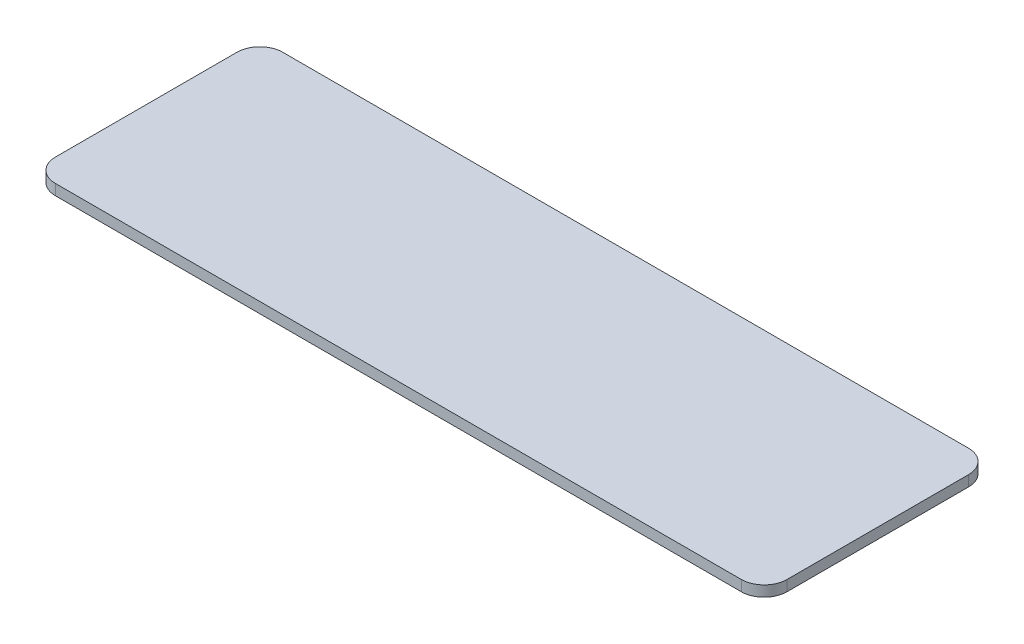
ISO-10303-21;
HEADER;
FILE_DESCRIPTION(('STEP AP214'),'2;1');
FILE_NAME('part.step','',(''),(''),'','','');
FILE_SCHEMA(('AUTOMOTIVE_DESIGN { 1 0 10303 214 1 1 1 1 }'));
ENDSEC;
DATA;
#1=APPLICATION_CONTEXT('core data for automotive mechanical design processes');
#2=APPLICATION_PROTOCOL_DEFINITION('international standard','automotive_design',2000,#1);
#3=PRODUCT_CONTEXT('',#1,'mechanical');
#4=PRODUCT('Part','Part','',(#3));
#5=PRODUCT_RELATED_PRODUCT_CATEGORY('part','',(#4));
#6=PRODUCT_DEFINITION_FORMATION('','',#4);
#7=PRODUCT_DEFINITION_CONTEXT('part definition',#1,'design');
#8=PRODUCT_DEFINITION('design','',#6,#7);
#9=PRODUCT_DEFINITION_SHAPE('','',#8);
#10=(LENGTH_UNIT() NAMED_UNIT(*) SI_UNIT(.MILLI.,.METRE.));
#11=(NAMED_UNIT(*) PLANE_ANGLE_UNIT() SI_UNIT($,.RADIAN.));
#12=(NAMED_UNIT(*) SI_UNIT($,.STERADIAN.) SOLID_ANGLE_UNIT());
#13=UNCERTAINTY_MEASURE_WITH_UNIT(LENGTH_MEASURE(1.E-05),#10,'distance_accuracy_value','');
#14=(GEOMETRIC_REPRESENTATION_CONTEXT(3) GLOBAL_UNCERTAINTY_ASSIGNED_CONTEXT((#13)) GLOBAL_UNIT_ASSIGNED_CONTEXT((#10,
#11,#12)) REPRESENTATION_CONTEXT('',''));
#15=CARTESIAN_POINT('',(0.,0.,0.));
#16=DIRECTION('',(0.,0.,1.));
#17=DIRECTION('',(1.,0.,0.));
#18=AXIS2_PLACEMENT_3D('',#15,#16,#17);
#19=CARTESIAN_POINT('',(51.,1.5875,-13.5));
#20=DIRECTION('',(0.,-1.,0.));
#21=DIRECTION('',(0.,0.,-1.));
#22=AXIS2_PLACEMENT_3D('',#19,#20,#21);
#23=CYLINDRICAL_SURFACE('',#22,3.4);
#24=CARTESIAN_POINT('',(51.,0.,-13.5));
#25=DIRECTION('',(0.,1.,0.));
#26=DIRECTION('',(0.,0.,1.));
#27=AXIS2_PLACEMENT_3D('',#24,#25,#26);
#28=CIRCLE('',#27,3.4);
#29=CARTESIAN_POINT('',(54.4,0.,-13.5));
#30=VERTEX_POINT('',#29);
#31=CARTESIAN_POINT('',(51.,0.,-16.9));
#32=VERTEX_POINT('',#31);
#33=EDGE_CURVE('E135',#30,#32,#28,.T.);
#34=ORIENTED_EDGE('',*,*,#33,.T.);
#35=DIRECTION('',(0.,-1.,0.));
#36=VECTOR('',#35,1.);
#37=CARTESIAN_POINT('',(51.,1.5875,-16.9));
#38=LINE('',#37,#36);
#39=CARTESIAN_POINT('',(51.,1.5875,-16.9));
#40=VERTEX_POINT('',#39);
#41=EDGE_CURVE('E11',#40,#32,#38,.T.);
#42=ORIENTED_EDGE('',*,*,#41,.F.);
#43=CARTESIAN_POINT('',(51.,1.5875,-13.5));
#44=DIRECTION('',(0.,1.,0.));
#45=DIRECTION('',(0.,0.,1.));
#46=AXIS2_PLACEMENT_3D('',#43,#44,#45);
#47=CIRCLE('',#46,3.4);
#48=CARTESIAN_POINT('',(54.4,1.5875,-13.5));
#49=VERTEX_POINT('',#48);
#50=EDGE_CURVE('E151',#49,#40,#47,.T.);
#51=ORIENTED_EDGE('',*,*,#50,.F.);
#52=DIRECTION('',(0.,-1.,0.));
#53=VECTOR('',#52,1.);
#54=CARTESIAN_POINT('',(54.4,1.5875,-13.5));
#55=LINE('',#54,#53);
#56=EDGE_CURVE('E131',#49,#30,#55,.T.);
#57=ORIENTED_EDGE('',*,*,#56,.T.);
#58=EDGE_LOOP('',(#34,#42,#51,#57));
#59=FACE_BOUND('',#58,.T.);
#60=ADVANCED_FACE('F38',(#59),#23,.T.);
#61=CARTESIAN_POINT('',(51.,1.5875,-16.9));
#62=DIRECTION('',(0.,0.,1.));
#63=DIRECTION('',(1.,0.,0.));
#64=AXIS2_PLACEMENT_3D('',#61,#62,#63);
#65=PLANE('',#64);
#66=DIRECTION('',(-1.,0.,0.));
#67=VECTOR('',#66,1.);
#68=CARTESIAN_POINT('',(51.,0.,-16.9));
#69=LINE('',#68,#67);
#70=CARTESIAN_POINT('',(-51.,0.,-16.9));
#71=VERTEX_POINT('',#70);
#72=EDGE_CURVE('E138',#32,#71,#69,.T.);
#73=ORIENTED_EDGE('',*,*,#72,.T.);
#74=DIRECTION('',(0.,-1.,0.));
#75=VECTOR('',#74,1.);
#76=CARTESIAN_POINT('',(-51.,1.5875,-16.9));
#77=LINE('',#76,#75);
#78=CARTESIAN_POINT('',(-51.,1.5875,-16.9));
#79=VERTEX_POINT('',#78);
#80=EDGE_CURVE('E46',#79,#71,#77,.T.);
#81=ORIENTED_EDGE('',*,*,#80,.F.);
#82=DIRECTION('',(-1.,0.,0.));
#83=VECTOR('',#82,1.);
#84=CARTESIAN_POINT('',(51.,1.5875,-16.9));
#85=LINE('',#84,#83);
#86=EDGE_CURVE('E97',#40,#79,#85,.T.);
#87=ORIENTED_EDGE('',*,*,#86,.F.);
#88=ORIENTED_EDGE('',*,*,#41,.T.);
#89=EDGE_LOOP('',(#73,#81,#87,#88));
#90=FACE_BOUND('',#89,.T.);
#91=ADVANCED_FACE('F186',(#90),#65,.F.);
#92=CARTESIAN_POINT('',(-51.,1.5875,-13.5));
#93=DIRECTION('',(0.,-1.,0.));
#94=DIRECTION('',(0.,0.,-1.));
#95=AXIS2_PLACEMENT_3D('',#92,#93,#94);
#96=CYLINDRICAL_SURFACE('',#95,3.40000000000001);
#97=CARTESIAN_POINT('',(-51.,0.,-13.5));
#98=DIRECTION('',(0.,1.,0.));
#99=DIRECTION('',(0.,0.,1.));
#100=AXIS2_PLACEMENT_3D('',#97,#98,#99);
#101=CIRCLE('',#100,3.40000000000001);
#102=CARTESIAN_POINT('',(-54.4,0.,-13.5));
#103=VERTEX_POINT('',#102);
#104=EDGE_CURVE('E141',#71,#103,#101,.T.);
#105=ORIENTED_EDGE('',*,*,#104,.T.);
#106=DIRECTION('',(0.,-1.,0.));
#107=VECTOR('',#106,1.);
#108=CARTESIAN_POINT('',(-54.4,1.5875,-13.5));
#109=LINE('',#108,#107);
#110=CARTESIAN_POINT('',(-54.4,1.5875,-13.5));
#111=VERTEX_POINT('',#110);
#112=EDGE_CURVE('E158',#111,#103,#109,.T.);
#113=ORIENTED_EDGE('',*,*,#112,.F.);
#114=CARTESIAN_POINT('',(-51.,1.5875,-13.5));
#115=DIRECTION('',(0.,1.,0.));
#116=DIRECTION('',(0.,0.,1.));
#117=AXIS2_PLACEMENT_3D('',#114,#115,#116);
#118=CIRCLE('',#117,3.40000000000001);
#119=EDGE_CURVE('E166',#79,#111,#118,.T.);
#120=ORIENTED_EDGE('',*,*,#119,.F.);
#121=ORIENTED_EDGE('',*,*,#80,.T.);
#122=EDGE_LOOP('',(#105,#113,#120,#121));
#123=FACE_BOUND('',#122,.T.);
#124=ADVANCED_FACE('F164',(#123),#96,.T.);
#125=CARTESIAN_POINT('',(-54.4,1.5875,13.5));
#126=DIRECTION('',(1.,0.,0.));
#127=DIRECTION('',(0.,0.,-1.));
#128=AXIS2_PLACEMENT_3D('',#125,#126,#127);
#129=PLANE('',#128);
#130=DIRECTION('',(0.,0.,1.));
#131=VECTOR('',#130,1.);
#132=CARTESIAN_POINT('',(-54.4,0.,13.5));
#133=LINE('',#132,#131);
#134=CARTESIAN_POINT('',(-54.4,0.,13.5));
#135=VERTEX_POINT('',#134);
#136=EDGE_CURVE('E143',#103,#135,#133,.T.);
#137=ORIENTED_EDGE('',*,*,#136,.T.);
#138=DIRECTION('',(0.,-1.,0.));
#139=VECTOR('',#138,1.);
#140=CARTESIAN_POINT('',(-54.4,1.5875,13.5));
#141=LINE('',#140,#139);
#142=CARTESIAN_POINT('',(-54.4,1.5875,13.5));
#143=VERTEX_POINT('',#142);
#144=EDGE_CURVE('E155',#143,#135,#141,.T.);
#145=ORIENTED_EDGE('',*,*,#144,.F.);
#146=DIRECTION('',(0.,0.,1.));
#147=VECTOR('',#146,1.);
#148=CARTESIAN_POINT('',(-54.4,1.5875,13.5));
#149=LINE('',#148,#147);
#150=EDGE_CURVE('E178',#111,#143,#149,.T.);
#151=ORIENTED_EDGE('',*,*,#150,.F.);
#152=ORIENTED_EDGE('',*,*,#112,.T.);
#153=EDGE_LOOP('',(#137,#145,#151,#152));
#154=FACE_BOUND('',#153,.T.);
#155=ADVANCED_FACE('F174',(#154),#129,.F.);
#156=CARTESIAN_POINT('',(-51.,1.5875,13.5));
#157=DIRECTION('',(0.,-1.,0.));
#158=DIRECTION('',(0.,0.,-1.));
#159=AXIS2_PLACEMENT_3D('',#156,#157,#158);
#160=CYLINDRICAL_SURFACE('',#159,3.4);
#161=CARTESIAN_POINT('',(-51.,0.,13.5));
#162=DIRECTION('',(0.,1.,0.));
#163=DIRECTION('',(0.,0.,-1.));
#164=AXIS2_PLACEMENT_3D('',#161,#162,#163);
#165=CIRCLE('',#164,3.4);
#166=CARTESIAN_POINT('',(-51.,0.,16.9));
#167=VERTEX_POINT('',#166);
#168=EDGE_CURVE('E145',#135,#167,#165,.T.);
#169=ORIENTED_EDGE('',*,*,#168,.T.);
#170=DIRECTION('',(0.,-1.,0.));
#171=VECTOR('',#170,1.);
#172=CARTESIAN_POINT('',(-51.,1.5875,16.9));
#173=LINE('',#172,#171);
#174=CARTESIAN_POINT('',(-51.,1.5875,16.9));
#175=VERTEX_POINT('',#174);
#176=EDGE_CURVE('E126',#175,#167,#173,.T.);
#177=ORIENTED_EDGE('',*,*,#176,.F.);
#178=CARTESIAN_POINT('',(-51.,1.5875,13.5));
#179=DIRECTION('',(0.,1.,0.));
#180=DIRECTION('',(0.,0.,-1.));
#181=AXIS2_PLACEMENT_3D('',#178,#179,#180);
#182=CIRCLE('',#181,3.4);
#183=EDGE_CURVE('E116',#143,#175,#182,.T.);
#184=ORIENTED_EDGE('',*,*,#183,.F.);
#185=ORIENTED_EDGE('',*,*,#144,.T.);
#186=EDGE_LOOP('',(#169,#177,#184,#185));
#187=FACE_BOUND('',#186,.T.);
#188=ADVANCED_FACE('F177',(#187),#160,.T.);
#189=CARTESIAN_POINT('',(51.,1.5875,16.9));
#190=DIRECTION('',(0.,0.,-1.));
#191=DIRECTION('',(-1.,0.,0.));
#192=AXIS2_PLACEMENT_3D('',#189,#190,#191);
#193=PLANE('',#192);
#194=DIRECTION('',(1.,0.,0.));
#195=VECTOR('',#194,1.);
#196=CARTESIAN_POINT('',(51.,0.,16.9));
#197=LINE('',#196,#195);
#198=CARTESIAN_POINT('',(51.,0.,16.9));
#199=VERTEX_POINT('',#198);
#200=EDGE_CURVE('E125',#167,#199,#197,.T.);
#201=ORIENTED_EDGE('',*,*,#200,.T.);
#202=DIRECTION('',(0.,-1.,0.));
#203=VECTOR('',#202,1.);
#204=CARTESIAN_POINT('',(51.,1.5875,16.9));
#205=LINE('',#204,#203);
#206=CARTESIAN_POINT('',(51.,1.5875,16.9));
#207=VERTEX_POINT('',#206);
#208=EDGE_CURVE('E122',#207,#199,#205,.T.);
#209=ORIENTED_EDGE('',*,*,#208,.F.);
#210=DIRECTION('',(1.,0.,0.));
#211=VECTOR('',#210,1.);
#212=CARTESIAN_POINT('',(51.,1.5875,16.9));
#213=LINE('',#212,#211);
#214=EDGE_CURVE('E110',#175,#207,#213,.T.);
#215=ORIENTED_EDGE('',*,*,#214,.F.);
#216=ORIENTED_EDGE('',*,*,#176,.T.);
#217=EDGE_LOOP('',(#201,#209,#215,#216));
#218=FACE_BOUND('',#217,.T.);
#219=ADVANCED_FACE('F123',(#218),#193,.F.);
#220=CARTESIAN_POINT('',(51.,1.5875,13.5));
#221=DIRECTION('',(0.,-1.,0.));
#222=DIRECTION('',(0.,0.,-1.));
#223=AXIS2_PLACEMENT_3D('',#220,#221,#222);
#224=CYLINDRICAL_SURFACE('',#223,3.4);
#225=CARTESIAN_POINT('',(51.,0.,13.5));
#226=DIRECTION('',(0.,1.,0.));
#227=DIRECTION('',(0.,0.,1.));
#228=AXIS2_PLACEMENT_3D('',#225,#226,#227);
#229=CIRCLE('',#228,3.4);
#230=CARTESIAN_POINT('',(54.4,0.,13.5));
#231=VERTEX_POINT('',#230);
#232=EDGE_CURVE('E83',#199,#231,#229,.T.);
#233=ORIENTED_EDGE('',*,*,#232,.T.);
#234=DIRECTION('',(0.,-1.,0.));
#235=VECTOR('',#234,1.);
#236=CARTESIAN_POINT('',(54.4,1.5875,13.5));
#237=LINE('',#236,#235);
#238=CARTESIAN_POINT('',(54.4,1.5875,13.5));
#239=VERTEX_POINT('',#238);
#240=EDGE_CURVE('E127',#239,#231,#237,.T.);
#241=ORIENTED_EDGE('',*,*,#240,.F.);
#242=CARTESIAN_POINT('',(51.,1.5875,13.5));
#243=DIRECTION('',(0.,1.,0.));
#244=DIRECTION('',(0.,0.,1.));
#245=AXIS2_PLACEMENT_3D('',#242,#243,#244);
#246=CIRCLE('',#245,3.4);
#247=EDGE_CURVE('E114',#207,#239,#246,.T.);
#248=ORIENTED_EDGE('',*,*,#247,.F.);
#249=ORIENTED_EDGE('',*,*,#208,.T.);
#250=EDGE_LOOP('',(#233,#241,#248,#249));
#251=FACE_BOUND('',#250,.T.);
#252=ADVANCED_FACE('F129',(#251),#224,.T.);
#253=CARTESIAN_POINT('',(54.4,1.5875,13.5));
#254=DIRECTION('',(-1.,0.,0.));
#255=DIRECTION('',(0.,0.,1.));
#256=AXIS2_PLACEMENT_3D('',#253,#254,#255);
#257=PLANE('',#256);
#258=DIRECTION('',(0.,0.,-1.));
#259=VECTOR('',#258,1.);
#260=CARTESIAN_POINT('',(54.4,0.,13.5));
#261=LINE('',#260,#259);
#262=EDGE_CURVE('E89',#231,#30,#261,.T.);
#263=ORIENTED_EDGE('',*,*,#262,.T.);
#264=ORIENTED_EDGE('',*,*,#56,.F.);
#265=DIRECTION('',(0.,0.,-1.));
#266=VECTOR('',#265,1.);
#267=CARTESIAN_POINT('',(54.4,1.5875,13.5));
#268=LINE('',#267,#266);
#269=EDGE_CURVE('E54',#239,#49,#268,.T.);
#270=ORIENTED_EDGE('',*,*,#269,.F.);
#271=ORIENTED_EDGE('',*,*,#240,.T.);
#272=EDGE_LOOP('',(#263,#264,#270,#271));
#273=FACE_BOUND('',#272,.T.);
#274=ADVANCED_FACE('F202',(#273),#257,.F.);
#275=CARTESIAN_POINT('',(51.,1.5875,-13.5));
#276=DIRECTION('',(0.,1.,0.));
#277=DIRECTION('',(0.,0.,1.));
#278=AXIS2_PLACEMENT_3D('',#275,#276,#277);
#279=PLANE('',#278);
#280=ORIENTED_EDGE('',*,*,#50,.T.);
#281=ORIENTED_EDGE('',*,*,#86,.T.);
#282=ORIENTED_EDGE('',*,*,#119,.T.);
#283=ORIENTED_EDGE('',*,*,#150,.T.);
#284=ORIENTED_EDGE('',*,*,#183,.T.);
#285=ORIENTED_EDGE('',*,*,#214,.T.);
#286=ORIENTED_EDGE('',*,*,#247,.T.);
#287=ORIENTED_EDGE('',*,*,#269,.T.);
#288=EDGE_LOOP('',(#280,#281,#282,#283,#284,#285,#286,#287));
#289=FACE_BOUND('',#288,.T.);
#290=ADVANCED_FACE('F112',(#289),#279,.T.);
#291=CARTESIAN_POINT('',(51.,0.,-13.5));
#292=DIRECTION('',(0.,1.,0.));
#293=DIRECTION('',(0.,0.,1.));
#294=AXIS2_PLACEMENT_3D('',#291,#292,#293);
#295=PLANE('',#294);
#296=ORIENTED_EDGE('',*,*,#33,.F.);
#297=ORIENTED_EDGE('',*,*,#262,.F.);
#298=ORIENTED_EDGE('',*,*,#232,.F.);
#299=ORIENTED_EDGE('',*,*,#200,.F.);
#300=ORIENTED_EDGE('',*,*,#168,.F.);
#301=ORIENTED_EDGE('',*,*,#136,.F.);
#302=ORIENTED_EDGE('',*,*,#104,.F.);
#303=ORIENTED_EDGE('',*,*,#72,.F.);
#304=EDGE_LOOP('',(#296,#297,#298,#299,#300,#301,#302,#303));
#305=FACE_BOUND('',#304,.T.);
#306=ADVANCED_FACE('F170',(#305),#295,.F.);
#307=CLOSED_SHELL('',(#60,#91,#124,#155,#188,#219,#252,#274,#290,#306));
#308=MANIFOLD_SOLID_BREP('B2',#307);
#309=ADVANCED_BREP_SHAPE_REPRESENTATION('',(#18,#308),#14);
#310=SHAPE_DEFINITION_REPRESENTATION(#9,#309);
ENDSEC;
END-ISO-10303-21;
